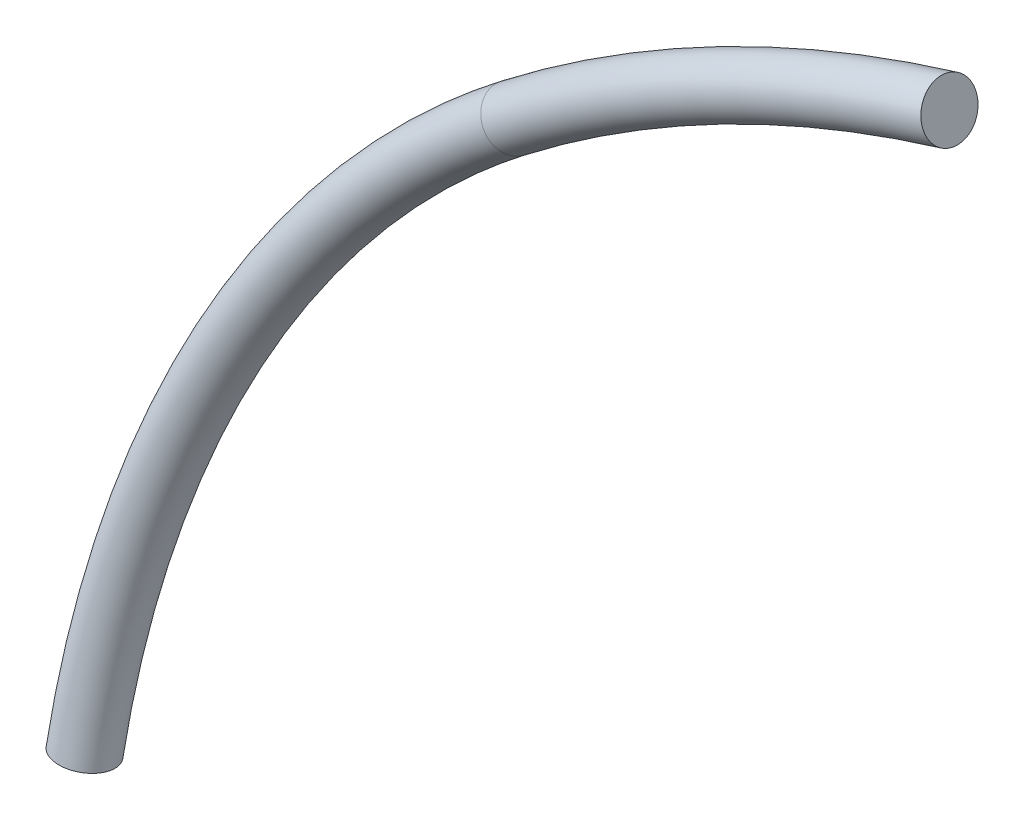
ISO-10303-21;
HEADER;
FILE_DESCRIPTION(('STEP AP214'),'2;1');
FILE_NAME('part.step','',(''),(''),'','','');
FILE_SCHEMA(('AUTOMOTIVE_DESIGN { 1 0 10303 214 1 1 1 1 }'));
ENDSEC;
DATA;
#1=APPLICATION_CONTEXT('core data for automotive mechanical design processes');
#2=APPLICATION_PROTOCOL_DEFINITION('international standard','automotive_design',2000,#1);
#3=PRODUCT_CONTEXT('',#1,'mechanical');
#4=PRODUCT('Part','Part','',(#3));
#5=PRODUCT_RELATED_PRODUCT_CATEGORY('part','',(#4));
#6=PRODUCT_DEFINITION_FORMATION('','',#4);
#7=PRODUCT_DEFINITION_CONTEXT('part definition',#1,'design');
#8=PRODUCT_DEFINITION('design','',#6,#7);
#9=PRODUCT_DEFINITION_SHAPE('','',#8);
#10=(LENGTH_UNIT() NAMED_UNIT(*) SI_UNIT(.MILLI.,.METRE.));
#11=(NAMED_UNIT(*) PLANE_ANGLE_UNIT() SI_UNIT($,.RADIAN.));
#12=(NAMED_UNIT(*) SI_UNIT($,.STERADIAN.) SOLID_ANGLE_UNIT());
#13=UNCERTAINTY_MEASURE_WITH_UNIT(LENGTH_MEASURE(1.E-05),#10,'distance_accuracy_value','');
#14=(GEOMETRIC_REPRESENTATION_CONTEXT(3) GLOBAL_UNCERTAINTY_ASSIGNED_CONTEXT((#13)) GLOBAL_UNIT_ASSIGNED_CONTEXT((#10,
#11,#12)) REPRESENTATION_CONTEXT('',''));
#15=CARTESIAN_POINT('',(0.,0.,0.));
#16=DIRECTION('',(0.,0.,1.));
#17=DIRECTION('',(1.,0.,0.));
#18=AXIS2_PLACEMENT_3D('',#15,#16,#17);
#19=CARTESIAN_POINT('',(2855.26413253938,-2486.1779851295,0.));
#20=DIRECTION('',(0.,0.,-1.));
#21=DIRECTION('',(-1.,0.,0.));
#22=AXIS2_PLACEMENT_3D('',#19,#20,#21);
#23=TOROIDAL_SURFACE('',#22,2525.22244021807,50.8000000000452);
#24=CARTESIAN_POINT('',(1312.52847718327,-486.999386235985,0.));
#25=DIRECTION('',(-0.79168415702851,-0.610930597948783,0.));
#26=DIRECTION('',(0.610930597948783,-0.79168415702851,0.));
#27=AXIS2_PLACEMENT_3D('',#24,#25,#26);
#28=CIRCLE('',#27,50.8000000000452);
#29=CARTESIAN_POINT('',(1281.49320280744,-446.7818310589,0.));
#30=VERTEX_POINT('',#29);
#31=EDGE_CURVE('E10',#30,#30,#28,.T.);
#32=CARTESIAN_POINT('',(2120.77012035913,-70.1343351404848,0.));
#33=DIRECTION('',(-0.956764683977851,-0.290863094071356,0.));
#34=DIRECTION('',(0.290863094071356,-0.956764683977851,0.));
#35=AXIS2_PLACEMENT_3D('',#32,#33,#34);
#36=CIRCLE('',#35,50.8000000000452);
#37=CARTESIAN_POINT('',(2105.99427518029,-21.5306891943667,0.));
#38=VERTEX_POINT('',#37);
#39=EDGE_CURVE('E41',#38,#38,#36,.T.);
#40=CARTESIAN_POINT('',(2855.26413253938,-2486.1779851295,0.));
#41=DIRECTION('',(0.,0.,-1.));
#42=DIRECTION('',(-1.,0.,0.));
#43=AXIS2_PLACEMENT_3D('',#40,#41,#42);
#44=CIRCLE('',#43,2576.02244021811);
#45=EDGE_CURVE('',#30,#38,#44,.T.);
#46=ORIENTED_EDGE('',*,*,#31,.F.);
#47=ORIENTED_EDGE('',*,*,#39,.T.);
#48=ORIENTED_EDGE('',*,*,#45,.T.);
#49=ORIENTED_EDGE('',*,*,#45,.F.);
#50=EDGE_LOOP('',(#46,#48,#47,#49));
#51=FACE_BOUND('',#50,.T.);
#52=ADVANCED_FACE('F35',(#51),#23,.T.);
#53=CARTESIAN_POINT('',(2120.77012035913,-70.1343351404848,0.));
#54=DIRECTION('',(-0.956764683977851,-0.290863094071356,0.));
#55=DIRECTION('',(0.290863094071356,-0.956764683977851,0.));
#56=AXIS2_PLACEMENT_3D('',#53,#54,#55);
#57=PLANE('',#56);
#58=ORIENTED_EDGE('',*,*,#39,.F.);
#59=EDGE_LOOP('',(#58));
#60=FACE_BOUND('',#59,.T.);
#61=ADVANCED_FACE('F56',(#60),#57,.F.);
#62=CARTESIAN_POINT('',(2360.80013407809,-1845.41892818079,307.801813345474));
#63=DIRECTION('',(0.107870696631571,-0.139785962296821,-0.984288472731938));
#64=DIRECTION('',(0.,0.990065572277436,-0.140606410205767));
#65=AXIS2_PLACEMENT_3D('',#62,#63,#64);
#66=TOROIDAL_SURFACE('',#65,1743.24957332142,50.8000000006201);
#67=CARTESIAN_POINT('',(629.634352576026,-1790.78402012322,110.319817550398));
#68=DIRECTION('',(-0.0466839185127655,-0.989685625043294,0.135436240847707));
#69=DIRECTION('',(0.996512114923774,-0.0555301342771039,-0.0622897182311399));
#70=AXIS2_PLACEMENT_3D('',#67,#68,#69);
#71=CIRCLE('',#70,50.8000000006201);
#72=CARTESIAN_POINT('',(680.257168014771,-1793.60495094453,107.155499864217));
#73=VERTEX_POINT('',#72);
#74=EDGE_CURVE('E45',#73,#73,#71,.T.);
#75=ORIENTED_EDGE('',*,*,#74,.F.);
#76=EDGE_LOOP('',(#75));
#77=FACE_BOUND('',#76,.T.);
#78=ORIENTED_EDGE('',*,*,#31,.T.);
#79=EDGE_LOOP('',(#78));
#80=FACE_BOUND('',#79,.T.);
#81=ADVANCED_FACE('F54',(#77,#80),#66,.T.);
#82=CARTESIAN_POINT('',(629.634352576026,-1790.78402012322,110.319817550398));
#83=DIRECTION('',(-0.0466839185127655,-0.989685625043294,0.135436240847707));
#84=DIRECTION('',(0.996512114923774,-0.0555301342771039,-0.0622897182311399));
#85=AXIS2_PLACEMENT_3D('',#82,#83,#84);
#86=PLANE('',#85);
#87=ORIENTED_EDGE('',*,*,#74,.T.);
#88=EDGE_LOOP('',(#87));
#89=FACE_BOUND('',#88,.T.);
#90=ADVANCED_FACE('F52',(#89),#86,.T.);
#91=CLOSED_SHELL('',(#52,#61,#81,#90));
#92=MANIFOLD_SOLID_BREP('B2',#91);
#93=ADVANCED_BREP_SHAPE_REPRESENTATION('',(#18,#92),#14);
#94=SHAPE_DEFINITION_REPRESENTATION(#9,#93);
ENDSEC;
END-ISO-10303-21;
